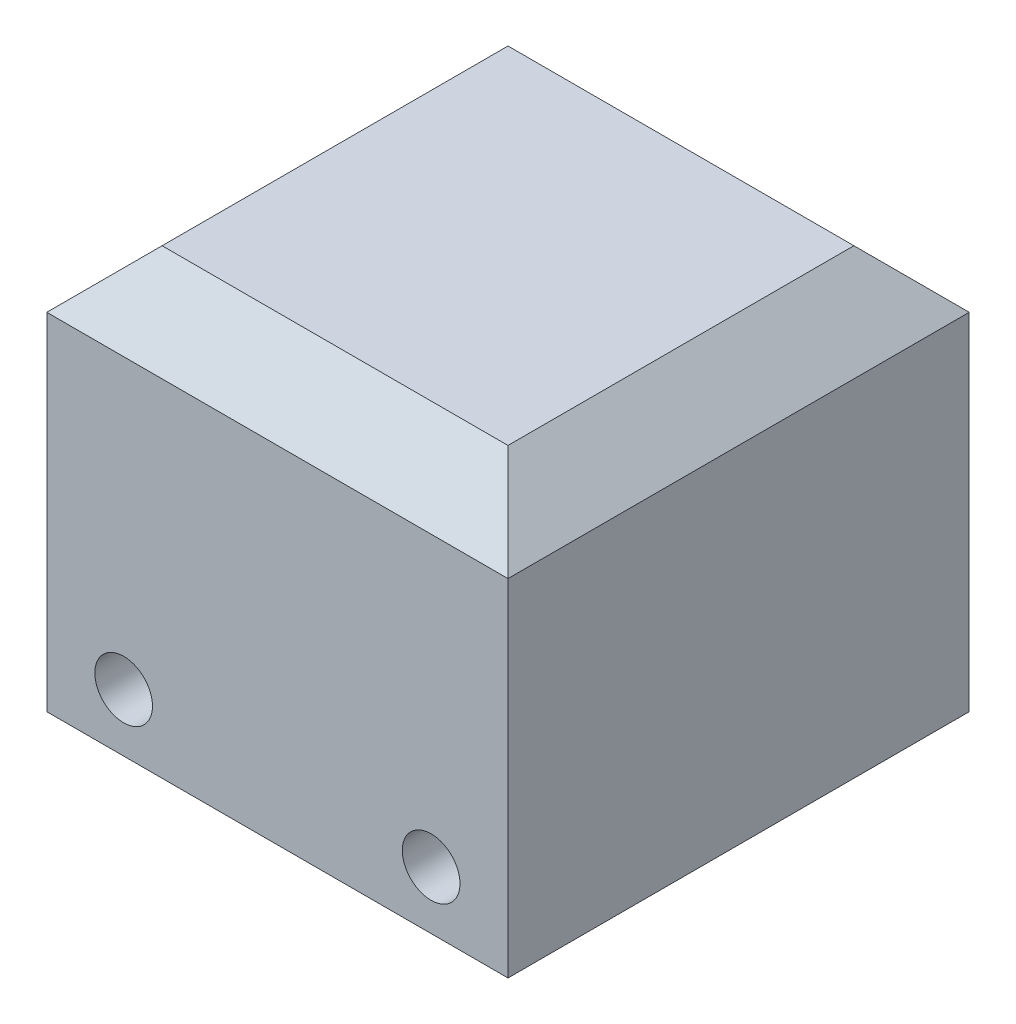
ISO-10303-21;
HEADER;
FILE_DESCRIPTION(('STEP AP214'),'2;1');
FILE_NAME('part.step','',(''),(''),'','','');
FILE_SCHEMA(('AUTOMOTIVE_DESIGN { 1 0 10303 214 1 1 1 1 }'));
ENDSEC;
DATA;
#1=APPLICATION_CONTEXT('core data for automotive mechanical design processes');
#2=APPLICATION_PROTOCOL_DEFINITION('international standard','automotive_design',2000,#1);
#3=PRODUCT_CONTEXT('',#1,'mechanical');
#4=PRODUCT('Part','Part','',(#3));
#5=PRODUCT_RELATED_PRODUCT_CATEGORY('part','',(#4));
#6=PRODUCT_DEFINITION_FORMATION('','',#4);
#7=PRODUCT_DEFINITION_CONTEXT('part definition',#1,'design');
#8=PRODUCT_DEFINITION('design','',#6,#7);
#9=PRODUCT_DEFINITION_SHAPE('','',#8);
#10=(LENGTH_UNIT() NAMED_UNIT(*) SI_UNIT(.MILLI.,.METRE.));
#11=(NAMED_UNIT(*) PLANE_ANGLE_UNIT() SI_UNIT($,.RADIAN.));
#12=(NAMED_UNIT(*) SI_UNIT($,.STERADIAN.) SOLID_ANGLE_UNIT());
#13=UNCERTAINTY_MEASURE_WITH_UNIT(LENGTH_MEASURE(1.E-05),#10,'distance_accuracy_value','');
#14=(GEOMETRIC_REPRESENTATION_CONTEXT(3) GLOBAL_UNCERTAINTY_ASSIGNED_CONTEXT((#13)) GLOBAL_UNIT_ASSIGNED_CONTEXT((#10,
#11,#12)) REPRESENTATION_CONTEXT('',''));
#15=CARTESIAN_POINT('',(0.,0.,0.));
#16=DIRECTION('',(0.,0.,1.));
#17=DIRECTION('',(1.,0.,0.));
#18=AXIS2_PLACEMENT_3D('',#15,#16,#17);
#19=CARTESIAN_POINT('',(31.75,21.7518028846154,-38.1));
#20=DIRECTION('',(1.,0.,0.));
#21=DIRECTION('',(0.,1.,0.));
#22=AXIS2_PLACEMENT_3D('',#19,#20,#21);
#23=PLANE('',#22);
#24=DIRECTION('',(0.,1.,0.));
#25=VECTOR('',#24,1.);
#26=CARTESIAN_POINT('',(31.75,21.7518028846154,38.1));
#27=LINE('',#26,#25);
#28=CARTESIAN_POINT('',(31.75,-44.9231971153845,38.1));
#29=VERTEX_POINT('',#28);
#30=CARTESIAN_POINT('',(31.75,12.2268028846153,38.1));
#31=VERTEX_POINT('',#30);
#32=EDGE_CURVE('E210',#29,#31,#27,.T.);
#33=ORIENTED_EDGE('',*,*,#32,.F.);
#34=DIRECTION('',(0.,0.,-1.));
#35=VECTOR('',#34,1.);
#36=CARTESIAN_POINT('',(31.75,-44.9231971153846,-38.1));
#37=LINE('',#36,#35);
#38=CARTESIAN_POINT('',(31.75,-44.9231971153845,-38.1));
#39=VERTEX_POINT('',#38);
#40=EDGE_CURVE('E163',#29,#39,#37,.T.);
#41=ORIENTED_EDGE('',*,*,#40,.T.);
#42=DIRECTION('',(0.,1.,0.));
#43=VECTOR('',#42,1.);
#44=CARTESIAN_POINT('',(31.75,21.7518028846154,-38.1));
#45=LINE('',#44,#43);
#46=CARTESIAN_POINT('',(31.75,12.2268028846153,-38.1));
#47=VERTEX_POINT('',#46);
#48=EDGE_CURVE('E231',#39,#47,#45,.T.);
#49=ORIENTED_EDGE('',*,*,#48,.T.);
#50=DIRECTION('',(0.,0.,1.));
#51=VECTOR('',#50,1.);
#52=CARTESIAN_POINT('',(31.75,12.2268028846153,-38.1));
#53=LINE('',#52,#51);
#54=EDGE_CURVE('E160',#47,#31,#53,.T.);
#55=ORIENTED_EDGE('',*,*,#54,.T.);
#56=EDGE_LOOP('',(#33,#41,#49,#55));
#57=FACE_BOUND('',#56,.T.);
#58=ADVANCED_FACE('F41',(#57),#23,.T.);
#59=CARTESIAN_POINT('',(-44.45,-54.4481971153846,-38.1));
#60=DIRECTION('',(0.,-1.,0.));
#61=DIRECTION('',(0.,0.,-1.));
#62=AXIS2_PLACEMENT_3D('',#59,#60,#61);
#63=PLANE('',#62);
#64=DIRECTION('',(0.,0.,-1.));
#65=VECTOR('',#64,1.);
#66=CARTESIAN_POINT('',(-34.925,-54.4481971153846,-38.1));
#67=LINE('',#66,#65);
#68=CARTESIAN_POINT('',(-34.925,-54.4481971153846,28.575));
#69=VERTEX_POINT('',#68);
#70=CARTESIAN_POINT('',(-34.925,-54.4481971153846,-28.575));
#71=VERTEX_POINT('',#70);
#72=EDGE_CURVE('E134',#69,#71,#67,.T.);
#73=ORIENTED_EDGE('',*,*,#72,.T.);
#74=DIRECTION('',(1.,0.,0.));
#75=VECTOR('',#74,1.);
#76=CARTESIAN_POINT('',(31.75,-54.4481971153846,-28.575));
#77=LINE('',#76,#75);
#78=CARTESIAN_POINT('',(22.225,-54.4481971153846,-28.575));
#79=VERTEX_POINT('',#78);
#80=EDGE_CURVE('E113',#71,#79,#77,.T.);
#81=ORIENTED_EDGE('',*,*,#80,.T.);
#82=DIRECTION('',(0.,0.,1.));
#83=VECTOR('',#82,1.);
#84=CARTESIAN_POINT('',(22.225,-54.4481971153846,-38.1));
#85=LINE('',#84,#83);
#86=CARTESIAN_POINT('',(22.225,-54.4481971153846,28.575));
#87=VERTEX_POINT('',#86);
#88=EDGE_CURVE('E122',#79,#87,#85,.T.);
#89=ORIENTED_EDGE('',*,*,#88,.T.);
#90=DIRECTION('',(-1.,0.,0.));
#91=VECTOR('',#90,1.);
#92=CARTESIAN_POINT('',(-44.45,-54.4481971153846,28.575));
#93=LINE('',#92,#91);
#94=EDGE_CURVE('E129',#87,#69,#93,.T.);
#95=ORIENTED_EDGE('',*,*,#94,.T.);
#96=EDGE_LOOP('',(#73,#81,#89,#95));
#97=FACE_BOUND('',#96,.T.);
#98=ADVANCED_FACE('F132',(#97),#63,.T.);
#99=CARTESIAN_POINT('',(-44.45,21.7518028846154,-38.1));
#100=DIRECTION('',(-1.,0.,0.));
#101=DIRECTION('',(0.,-1.,0.));
#102=AXIS2_PLACEMENT_3D('',#99,#100,#101);
#103=PLANE('',#102);
#104=DIRECTION('',(0.,-1.,0.));
#105=VECTOR('',#104,1.);
#106=CARTESIAN_POINT('',(-44.45,21.7518028846154,-38.1));
#107=LINE('',#106,#105);
#108=CARTESIAN_POINT('',(-44.45,12.2268028846153,-38.1));
#109=VERTEX_POINT('',#108);
#110=CARTESIAN_POINT('',(-44.45,-44.9231971153845,-38.1));
#111=VERTEX_POINT('',#110);
#112=EDGE_CURVE('E130',#109,#111,#107,.T.);
#113=ORIENTED_EDGE('',*,*,#112,.T.);
#114=DIRECTION('',(0.,0.,1.));
#115=VECTOR('',#114,1.);
#116=CARTESIAN_POINT('',(-44.45,-44.9231971153846,-38.1));
#117=LINE('',#116,#115);
#118=CARTESIAN_POINT('',(-44.45,-44.9231971153845,38.1));
#119=VERTEX_POINT('',#118);
#120=EDGE_CURVE('E151',#111,#119,#117,.T.);
#121=ORIENTED_EDGE('',*,*,#120,.T.);
#122=DIRECTION('',(0.,-1.,0.));
#123=VECTOR('',#122,1.);
#124=CARTESIAN_POINT('',(-44.45,21.7518028846154,38.1));
#125=LINE('',#124,#123);
#126=CARTESIAN_POINT('',(-44.45,12.2268028846153,38.1));
#127=VERTEX_POINT('',#126);
#128=EDGE_CURVE('E207',#127,#119,#125,.T.);
#129=ORIENTED_EDGE('',*,*,#128,.F.);
#130=DIRECTION('',(0.,0.,-1.));
#131=VECTOR('',#130,1.);
#132=CARTESIAN_POINT('',(-44.45,12.2268028846153,-38.1));
#133=LINE('',#132,#131);
#134=EDGE_CURVE('E148',#127,#109,#133,.T.);
#135=ORIENTED_EDGE('',*,*,#134,.T.);
#136=EDGE_LOOP('',(#113,#121,#129,#135));
#137=FACE_BOUND('',#136,.T.);
#138=ADVANCED_FACE('F213',(#137),#103,.T.);
#139=CARTESIAN_POINT('',(-44.45,21.7518028846154,-38.1));
#140=DIRECTION('',(0.,1.,0.));
#141=DIRECTION('',(0.,0.,1.));
#142=AXIS2_PLACEMENT_3D('',#139,#140,#141);
#143=PLANE('',#142);
#144=DIRECTION('',(0.,0.,-1.));
#145=VECTOR('',#144,1.);
#146=CARTESIAN_POINT('',(22.225,21.7518028846154,-38.1));
#147=LINE('',#146,#145);
#148=CARTESIAN_POINT('',(22.225,21.7518028846154,28.575));
#149=VERTEX_POINT('',#148);
#150=CARTESIAN_POINT('',(22.225,21.7518028846154,-28.575));
#151=VERTEX_POINT('',#150);
#152=EDGE_CURVE('E52',#149,#151,#147,.T.);
#153=ORIENTED_EDGE('',*,*,#152,.T.);
#154=DIRECTION('',(-1.,0.,0.));
#155=VECTOR('',#154,1.);
#156=CARTESIAN_POINT('',(-44.45,21.7518028846154,-28.575));
#157=LINE('',#156,#155);
#158=CARTESIAN_POINT('',(-34.925,21.7518028846154,-28.575));
#159=VERTEX_POINT('',#158);
#160=EDGE_CURVE('E11',#151,#159,#157,.T.);
#161=ORIENTED_EDGE('',*,*,#160,.T.);
#162=DIRECTION('',(0.,0.,1.));
#163=VECTOR('',#162,1.);
#164=CARTESIAN_POINT('',(-34.925,21.7518028846154,-38.1));
#165=LINE('',#164,#163);
#166=CARTESIAN_POINT('',(-34.925,21.7518028846154,28.575));
#167=VERTEX_POINT('',#166);
#168=EDGE_CURVE('E166',#159,#167,#165,.T.);
#169=ORIENTED_EDGE('',*,*,#168,.T.);
#170=DIRECTION('',(1.,0.,0.));
#171=VECTOR('',#170,1.);
#172=CARTESIAN_POINT('',(-44.45,21.7518028846154,28.575));
#173=LINE('',#172,#171);
#174=EDGE_CURVE('E63',#167,#149,#173,.T.);
#175=ORIENTED_EDGE('',*,*,#174,.T.);
#176=EDGE_LOOP('',(#153,#161,#169,#175));
#177=FACE_BOUND('',#176,.T.);
#178=ADVANCED_FACE('F255',(#177),#143,.T.);
#179=CARTESIAN_POINT('',(0.,0.,-38.1));
#180=DIRECTION('',(0.,0.,1.));
#181=DIRECTION('',(1.,0.,0.));
#182=AXIS2_PLACEMENT_3D('',#179,#180,#181);
#183=PLANE('',#182);
#184=CARTESIAN_POINT('',(19.05,-35.3981971153846,-38.1));
#185=DIRECTION('',(0.,0.,1.));
#186=DIRECTION('',(-1.,0.,0.));
#187=AXIS2_PLACEMENT_3D('',#184,#185,#186);
#188=CIRCLE('',#187,4.7625);
#189=CARTESIAN_POINT('',(23.8125,-35.3981971153846,-38.1));
#190=VERTEX_POINT('',#189);
#191=EDGE_CURVE('E217',#190,#190,#188,.T.);
#192=ORIENTED_EDGE('',*,*,#191,.T.);
#193=EDGE_LOOP('',(#192));
#194=FACE_BOUND('',#193,.T.);
#195=CARTESIAN_POINT('',(-31.75,-35.3981971153846,-38.1));
#196=DIRECTION('',(0.,0.,1.));
#197=DIRECTION('',(1.,0.,0.));
#198=AXIS2_PLACEMENT_3D('',#195,#196,#197);
#199=CIRCLE('',#198,4.7625);
#200=CARTESIAN_POINT('',(-26.9875,-35.3981971153846,-38.1));
#201=VERTEX_POINT('',#200);
#202=EDGE_CURVE('E222',#201,#201,#199,.T.);
#203=ORIENTED_EDGE('',*,*,#202,.T.);
#204=EDGE_LOOP('',(#203));
#205=FACE_BOUND('',#204,.T.);
#206=ORIENTED_EDGE('',*,*,#48,.F.);
#207=DIRECTION('',(-1.,0.,0.));
#208=VECTOR('',#207,1.);
#209=CARTESIAN_POINT('',(-44.45,-44.9231971153846,-38.1));
#210=LINE('',#209,#208);
#211=EDGE_CURVE('E115',#39,#111,#210,.T.);
#212=ORIENTED_EDGE('',*,*,#211,.T.);
#213=ORIENTED_EDGE('',*,*,#112,.F.);
#214=DIRECTION('',(1.,0.,0.));
#215=VECTOR('',#214,1.);
#216=CARTESIAN_POINT('',(31.75,12.2268028846153,-38.1));
#217=LINE('',#216,#215);
#218=EDGE_CURVE('E137',#109,#47,#217,.T.);
#219=ORIENTED_EDGE('',*,*,#218,.T.);
#220=EDGE_LOOP('',(#206,#212,#213,#219));
#221=FACE_BOUND('',#220,.T.);
#222=ADVANCED_FACE('F244',(#194,#205,#221),#183,.F.);
#223=CARTESIAN_POINT('',(-31.75,-35.3981971153846,-38.1));
#224=DIRECTION('',(0.,0.,1.));
#225=DIRECTION('',(1.,0.,0.));
#226=AXIS2_PLACEMENT_3D('',#223,#224,#225);
#227=CYLINDRICAL_SURFACE('',#226,4.7625);
#228=CARTESIAN_POINT('',(-31.75,-35.3981971153846,38.1));
#229=DIRECTION('',(0.,0.,1.));
#230=DIRECTION('',(1.,0.,0.));
#231=AXIS2_PLACEMENT_3D('',#228,#229,#230);
#232=CIRCLE('',#231,4.7625);
#233=CARTESIAN_POINT('',(-26.9875,-35.3981971153846,38.1));
#234=VERTEX_POINT('',#233);
#235=EDGE_CURVE('E224',#234,#234,#232,.T.);
#236=CARTESIAN_POINT('',(-26.9875,-35.3981971153846,-38.1));
#237=CARTESIAN_POINT('',(-26.9875,-35.3981971153846,-37.30625));
#238=CARTESIAN_POINT('',(-26.9875,-35.3981971153846,-36.5125));
#239=CARTESIAN_POINT('',(-26.9875,-35.3981971153846,-34.925));
#240=CARTESIAN_POINT('',(-26.9875,-35.3981971153846,-34.13125));
#241=CARTESIAN_POINT('',(-26.9875,-35.3981971153846,-32.54375));
#242=CARTESIAN_POINT('',(-26.9875,-35.3981971153846,-31.75));
#243=CARTESIAN_POINT('',(-26.9875,-35.3981971153846,-30.1625));
#244=CARTESIAN_POINT('',(-26.9875,-35.3981971153846,-29.36875));
#245=CARTESIAN_POINT('',(-26.9875,-35.3981971153846,-27.78125));
#246=CARTESIAN_POINT('',(-26.9875,-35.3981971153846,-26.9875));
#247=CARTESIAN_POINT('',(-26.9875,-35.3981971153846,-25.4));
#248=CARTESIAN_POINT('',(-26.9875,-35.3981971153846,-24.60625));
#249=CARTESIAN_POINT('',(-26.9875,-35.3981971153846,-23.01875));
#250=CARTESIAN_POINT('',(-26.9875,-35.3981971153846,-22.225));
#251=CARTESIAN_POINT('',(-26.9875,-35.3981971153846,-20.6375));
#252=CARTESIAN_POINT('',(-26.9875,-35.3981971153846,-19.84375));
#253=CARTESIAN_POINT('',(-26.9875,-35.3981971153846,-18.25625));
#254=CARTESIAN_POINT('',(-26.9875,-35.3981971153846,-17.4625));
#255=CARTESIAN_POINT('',(-26.9875,-35.3981971153846,-15.875));
#256=CARTESIAN_POINT('',(-26.9875,-35.3981971153846,-15.08125));
#257=CARTESIAN_POINT('',(-26.9875,-35.3981971153846,-13.49375));
#258=CARTESIAN_POINT('',(-26.9875,-35.3981971153846,-12.7));
#259=CARTESIAN_POINT('',(-26.9875,-35.3981971153846,-11.1125));
#260=CARTESIAN_POINT('',(-26.9875,-35.3981971153846,-10.31875));
#261=CARTESIAN_POINT('',(-26.9875,-35.3981971153846,-8.73125));
#262=CARTESIAN_POINT('',(-26.9875,-35.3981971153846,-7.9375));
#263=CARTESIAN_POINT('',(-26.9875,-35.3981971153846,-6.35));
#264=CARTESIAN_POINT('',(-26.9875,-35.3981971153846,-5.55625));
#265=CARTESIAN_POINT('',(-26.9875,-35.3981971153846,-3.96875));
#266=CARTESIAN_POINT('',(-26.9875,-35.3981971153846,-3.175));
#267=CARTESIAN_POINT('',(-26.9875,-35.3981971153846,-1.5875));
#268=CARTESIAN_POINT('',(-26.9875,-35.3981971153846,-0.793750000000001));
#269=CARTESIAN_POINT('',(-26.9875,-35.3981971153846,0.793750000000001));
#270=CARTESIAN_POINT('',(-26.9875,-35.3981971153846,1.5875));
#271=CARTESIAN_POINT('',(-26.9875,-35.3981971153846,3.175));
#272=CARTESIAN_POINT('',(-26.9875,-35.3981971153846,3.96875));
#273=CARTESIAN_POINT('',(-26.9875,-35.3981971153846,5.55625));
#274=CARTESIAN_POINT('',(-26.9875,-35.3981971153846,6.35));
#275=CARTESIAN_POINT('',(-26.9875,-35.3981971153846,7.93750000000001));
#276=CARTESIAN_POINT('',(-26.9875,-35.3981971153846,8.73125));
#277=CARTESIAN_POINT('',(-26.9875,-35.3981971153846,10.31875));
#278=CARTESIAN_POINT('',(-26.9875,-35.3981971153846,11.1125));
#279=CARTESIAN_POINT('',(-26.9875,-35.3981971153846,12.7));
#280=CARTESIAN_POINT('',(-26.9875,-35.3981971153846,13.49375));
#281=CARTESIAN_POINT('',(-26.9875,-35.3981971153846,15.08125));
#282=CARTESIAN_POINT('',(-26.9875,-35.3981971153846,15.875));
#283=CARTESIAN_POINT('',(-26.9875,-35.3981971153846,17.4625));
#284=CARTESIAN_POINT('',(-26.9875,-35.3981971153846,18.25625));
#285=CARTESIAN_POINT('',(-26.9875,-35.3981971153846,19.84375));
#286=CARTESIAN_POINT('',(-26.9875,-35.3981971153846,20.6375));
#287=CARTESIAN_POINT('',(-26.9875,-35.3981971153846,22.225));
#288=CARTESIAN_POINT('',(-26.9875,-35.3981971153846,23.01875));
#289=CARTESIAN_POINT('',(-26.9875,-35.3981971153846,24.60625));
#290=CARTESIAN_POINT('',(-26.9875,-35.3981971153846,25.4));
#291=CARTESIAN_POINT('',(-26.9875,-35.3981971153846,26.9875));
#292=CARTESIAN_POINT('',(-26.9875,-35.3981971153846,27.78125));
#293=CARTESIAN_POINT('',(-26.9875,-35.3981971153846,29.36875));
#294=CARTESIAN_POINT('',(-26.9875,-35.3981971153846,30.1625));
#295=CARTESIAN_POINT('',(-26.9875,-35.3981971153846,31.75));
#296=CARTESIAN_POINT('',(-26.9875,-35.3981971153846,32.54375));
#297=CARTESIAN_POINT('',(-26.9875,-35.3981971153846,34.13125));
#298=CARTESIAN_POINT('',(-26.9875,-35.3981971153846,34.925));
#299=CARTESIAN_POINT('',(-26.9875,-35.3981971153846,36.5125));
#300=CARTESIAN_POINT('',(-26.9875,-35.3981971153846,37.30625));
#301=CARTESIAN_POINT('',(-26.9875,-35.3981971153846,38.1));
#302=B_SPLINE_CURVE_WITH_KNOTS('',3,(#236,#237,#238,#239,#240,#241,#242,#243,#244,#245,#246,
#247,#248,#249,#250,#251,#252,#253,#254,#255,#256,#257,#258,#259,#260,#261,#262,#263,#264,#265,
#266,#267,#268,#269,#270,#271,#272,#273,#274,#275,#276,#277,#278,#279,#280,#281,#282,#283,#284,
#285,#286,#287,#288,#289,#290,#291,#292,#293,#294,#295,#296,#297,#298,#299,#300,#301),
.UNSPECIFIED.,.F.,.F.,(4,2,2,2,2,2,2,2,2,2,2,2,2,2,2,2,2,2,2,2,2,2,2,2,2,2,2,2,2,2,2,2,4),(0.,
2.38124999999999,4.7625,7.14375,9.525,11.90625,14.2875,16.66875,19.05,21.43125,23.8125,26.19375,
28.575,30.95625,33.3375,35.71875,38.1,40.48125,42.8625,45.24375,47.625,50.00625,52.3875,
54.76875,57.15,59.53125,61.9125,64.29375,66.675,69.05625,71.4375,73.81875,76.2),.UNSPECIFIED.);
#303=EDGE_CURVE('BSEAM329',#201,#234,#302,.T.);
#304=ORIENTED_EDGE('',*,*,#202,.F.);
#305=ORIENTED_EDGE('',*,*,#235,.T.);
#306=ORIENTED_EDGE('',*,*,#303,.T.);
#307=ORIENTED_EDGE('',*,*,#303,.F.);
#308=EDGE_LOOP('',(#304,#306,#305,#307));
#309=FACE_BOUND('',#308,.T.);
#310=ADVANCED_FACE('F329',(#309),#227,.F.);
#311=CARTESIAN_POINT('',(19.05,-35.3981971153846,-38.1));
#312=DIRECTION('',(0.,0.,1.));
#313=DIRECTION('',(1.,0.,0.));
#314=AXIS2_PLACEMENT_3D('',#311,#312,#313);
#315=CYLINDRICAL_SURFACE('',#314,4.7625);
#316=CARTESIAN_POINT('',(19.05,-35.3981971153846,38.1));
#317=DIRECTION('',(0.,0.,1.));
#318=DIRECTION('',(-1.,0.,0.));
#319=AXIS2_PLACEMENT_3D('',#316,#317,#318);
#320=CIRCLE('',#319,4.7625);
#321=CARTESIAN_POINT('',(23.8125,-35.3981971153846,38.1));
#322=VERTEX_POINT('',#321);
#323=EDGE_CURVE('E181',#322,#322,#320,.T.);
#324=CARTESIAN_POINT('',(23.8125,-35.3981971153846,-38.1));
#325=CARTESIAN_POINT('',(23.8125,-35.3981971153846,-37.30625));
#326=CARTESIAN_POINT('',(23.8125,-35.3981971153846,-36.5125));
#327=CARTESIAN_POINT('',(23.8125,-35.3981971153846,-34.925));
#328=CARTESIAN_POINT('',(23.8125,-35.3981971153846,-34.13125));
#329=CARTESIAN_POINT('',(23.8125,-35.3981971153846,-32.54375));
#330=CARTESIAN_POINT('',(23.8125,-35.3981971153846,-31.75));
#331=CARTESIAN_POINT('',(23.8125,-35.3981971153846,-30.1625));
#332=CARTESIAN_POINT('',(23.8125,-35.3981971153846,-29.36875));
#333=CARTESIAN_POINT('',(23.8125,-35.3981971153846,-27.78125));
#334=CARTESIAN_POINT('',(23.8125,-35.3981971153846,-26.9875));
#335=CARTESIAN_POINT('',(23.8125,-35.3981971153846,-25.4));
#336=CARTESIAN_POINT('',(23.8125,-35.3981971153846,-24.60625));
#337=CARTESIAN_POINT('',(23.8125,-35.3981971153846,-23.01875));
#338=CARTESIAN_POINT('',(23.8125,-35.3981971153846,-22.225));
#339=CARTESIAN_POINT('',(23.8125,-35.3981971153846,-20.6375));
#340=CARTESIAN_POINT('',(23.8125,-35.3981971153846,-19.84375));
#341=CARTESIAN_POINT('',(23.8125,-35.3981971153846,-18.25625));
#342=CARTESIAN_POINT('',(23.8125,-35.3981971153846,-17.4625));
#343=CARTESIAN_POINT('',(23.8125,-35.3981971153846,-15.875));
#344=CARTESIAN_POINT('',(23.8125,-35.3981971153846,-15.08125));
#345=CARTESIAN_POINT('',(23.8125,-35.3981971153846,-13.49375));
#346=CARTESIAN_POINT('',(23.8125,-35.3981971153846,-12.7));
#347=CARTESIAN_POINT('',(23.8125,-35.3981971153846,-11.1125));
#348=CARTESIAN_POINT('',(23.8125,-35.3981971153846,-10.31875));
#349=CARTESIAN_POINT('',(23.8125,-35.3981971153846,-8.73125));
#350=CARTESIAN_POINT('',(23.8125,-35.3981971153846,-7.9375));
#351=CARTESIAN_POINT('',(23.8125,-35.3981971153846,-6.35));
#352=CARTESIAN_POINT('',(23.8125,-35.3981971153846,-5.55625));
#353=CARTESIAN_POINT('',(23.8125,-35.3981971153846,-3.96875));
#354=CARTESIAN_POINT('',(23.8125,-35.3981971153846,-3.175));
#355=CARTESIAN_POINT('',(23.8125,-35.3981971153846,-1.5875));
#356=CARTESIAN_POINT('',(23.8125,-35.3981971153846,-0.793750000000001));
#357=CARTESIAN_POINT('',(23.8125,-35.3981971153846,0.793750000000001));
#358=CARTESIAN_POINT('',(23.8125,-35.3981971153846,1.5875));
#359=CARTESIAN_POINT('',(23.8125,-35.3981971153846,3.175));
#360=CARTESIAN_POINT('',(23.8125,-35.3981971153846,3.96875));
#361=CARTESIAN_POINT('',(23.8125,-35.3981971153846,5.55625));
#362=CARTESIAN_POINT('',(23.8125,-35.3981971153846,6.35));
#363=CARTESIAN_POINT('',(23.8125,-35.3981971153846,7.93750000000001));
#364=CARTESIAN_POINT('',(23.8125,-35.3981971153846,8.73125));
#365=CARTESIAN_POINT('',(23.8125,-35.3981971153846,10.31875));
#366=CARTESIAN_POINT('',(23.8125,-35.3981971153846,11.1125));
#367=CARTESIAN_POINT('',(23.8125,-35.3981971153846,12.7));
#368=CARTESIAN_POINT('',(23.8125,-35.3981971153846,13.49375));
#369=CARTESIAN_POINT('',(23.8125,-35.3981971153846,15.08125));
#370=CARTESIAN_POINT('',(23.8125,-35.3981971153846,15.875));
#371=CARTESIAN_POINT('',(23.8125,-35.3981971153846,17.4625));
#372=CARTESIAN_POINT('',(23.8125,-35.3981971153846,18.25625));
#373=CARTESIAN_POINT('',(23.8125,-35.3981971153846,19.84375));
#374=CARTESIAN_POINT('',(23.8125,-35.3981971153846,20.6375));
#375=CARTESIAN_POINT('',(23.8125,-35.3981971153846,22.225));
#376=CARTESIAN_POINT('',(23.8125,-35.3981971153846,23.01875));
#377=CARTESIAN_POINT('',(23.8125,-35.3981971153846,24.60625));
#378=CARTESIAN_POINT('',(23.8125,-35.3981971153846,25.4));
#379=CARTESIAN_POINT('',(23.8125,-35.3981971153846,26.9875));
#380=CARTESIAN_POINT('',(23.8125,-35.3981971153846,27.78125));
#381=CARTESIAN_POINT('',(23.8125,-35.3981971153846,29.36875));
#382=CARTESIAN_POINT('',(23.8125,-35.3981971153846,30.1625));
#383=CARTESIAN_POINT('',(23.8125,-35.3981971153846,31.75));
#384=CARTESIAN_POINT('',(23.8125,-35.3981971153846,32.54375));
#385=CARTESIAN_POINT('',(23.8125,-35.3981971153846,34.13125));
#386=CARTESIAN_POINT('',(23.8125,-35.3981971153846,34.925));
#387=CARTESIAN_POINT('',(23.8125,-35.3981971153846,36.5125));
#388=CARTESIAN_POINT('',(23.8125,-35.3981971153846,37.30625));
#389=CARTESIAN_POINT('',(23.8125,-35.3981971153846,38.1));
#390=B_SPLINE_CURVE_WITH_KNOTS('',3,(#324,#325,#326,#327,#328,#329,#330,#331,#332,#333,#334,
#335,#336,#337,#338,#339,#340,#341,#342,#343,#344,#345,#346,#347,#348,#349,#350,#351,#352,#353,
#354,#355,#356,#357,#358,#359,#360,#361,#362,#363,#364,#365,#366,#367,#368,#369,#370,#371,#372,
#373,#374,#375,#376,#377,#378,#379,#380,#381,#382,#383,#384,#385,#386,#387,#388,#389),
.UNSPECIFIED.,.F.,.F.,(4,2,2,2,2,2,2,2,2,2,2,2,2,2,2,2,2,2,2,2,2,2,2,2,2,2,2,2,2,2,2,2,4),(0.,
2.38124999999999,4.7625,7.14375,9.525,11.90625,14.2875,16.66875,19.05,21.43125,23.8125,26.19375,
28.575,30.95625,33.3375,35.71875,38.1,40.48125,42.8625,45.24375,47.625,50.00625,52.3875,
54.76875,57.15,59.53125,61.9125,64.29375,66.675,69.05625,71.4375,73.81875,76.2),.UNSPECIFIED.);
#391=EDGE_CURVE('BSEAM320',#190,#322,#390,.T.);
#392=ORIENTED_EDGE('',*,*,#191,.F.);
#393=ORIENTED_EDGE('',*,*,#323,.T.);
#394=ORIENTED_EDGE('',*,*,#391,.T.);
#395=ORIENTED_EDGE('',*,*,#391,.F.);
#396=EDGE_LOOP('',(#392,#394,#393,#395));
#397=FACE_BOUND('',#396,.T.);
#398=ADVANCED_FACE('F320',(#397),#315,.F.);
#399=CARTESIAN_POINT('',(0.,0.,38.1));
#400=DIRECTION('',(0.,0.,1.));
#401=DIRECTION('',(1.,0.,0.));
#402=AXIS2_PLACEMENT_3D('',#399,#400,#401);
#403=PLANE('',#402);
#404=ORIENTED_EDGE('',*,*,#235,.F.);
#405=EDGE_LOOP('',(#404));
#406=FACE_BOUND('',#405,.T.);
#407=ORIENTED_EDGE('',*,*,#128,.T.);
#408=DIRECTION('',(1.,0.,0.));
#409=VECTOR('',#408,1.);
#410=CARTESIAN_POINT('',(0.,-44.9231971153846,38.1));
#411=LINE('',#410,#409);
#412=EDGE_CURVE('E157',#119,#29,#411,.T.);
#413=ORIENTED_EDGE('',*,*,#412,.T.);
#414=ORIENTED_EDGE('',*,*,#32,.T.);
#415=DIRECTION('',(-1.,0.,0.));
#416=VECTOR('',#415,1.);
#417=CARTESIAN_POINT('',(0.,12.2268028846153,38.1));
#418=LINE('',#417,#416);
#419=EDGE_CURVE('E154',#31,#127,#418,.T.);
#420=ORIENTED_EDGE('',*,*,#419,.T.);
#421=EDGE_LOOP('',(#407,#413,#414,#420));
#422=FACE_BOUND('',#421,.T.);
#423=ORIENTED_EDGE('',*,*,#323,.F.);
#424=EDGE_LOOP('',(#423));
#425=FACE_BOUND('',#424,.T.);
#426=ADVANCED_FACE('F205',(#406,#422,#425),#403,.T.);
#427=CARTESIAN_POINT('',(0.,-44.9231971153846,38.1));
#428=DIRECTION('',(0.,0.707106781186546,-0.707106781186549));
#429=DIRECTION('',(1.,0.,0.));
#430=AXIS2_PLACEMENT_3D('',#427,#428,#429);
#431=PLANE('',#430);
#432=DIRECTION('',(-0.577350269189625,-0.577350269189627,-0.577350269189625));
#433=VECTOR('',#432,1.);
#434=CARTESIAN_POINT('',(0.,-76.6731971153846,6.35000000000007));
#435=LINE('',#434,#433);
#436=EDGE_CURVE('E125',#29,#87,#435,.T.);
#437=ORIENTED_EDGE('',*,*,#436,.F.);
#438=ORIENTED_EDGE('',*,*,#412,.F.);
#439=DIRECTION('',(0.577350269189625,-0.577350269189628,-0.577350269189625));
#440=VECTOR('',#439,1.);
#441=CARTESIAN_POINT('',(-29.6333333333334,-59.7398637820513,23.2833333333334));
#442=LINE('',#441,#440);
#443=EDGE_CURVE('E177',#69,#119,#442,.F.);
#444=ORIENTED_EDGE('',*,*,#443,.F.);
#445=ORIENTED_EDGE('',*,*,#94,.F.);
#446=EDGE_LOOP('',(#437,#438,#444,#445));
#447=FACE_BOUND('',#446,.T.);
#448=ADVANCED_FACE('F239',(#447),#431,.F.);
#449=CARTESIAN_POINT('',(-44.45,-44.9231971153846,-38.1));
#450=DIRECTION('',(0.707106781186549,0.707106781186546,0.));
#451=DIRECTION('',(0.,0.,1.));
#452=AXIS2_PLACEMENT_3D('',#449,#450,#451);
#453=PLANE('',#452);
#454=ORIENTED_EDGE('',*,*,#443,.T.);
#455=ORIENTED_EDGE('',*,*,#120,.F.);
#456=DIRECTION('',(-0.577350269189625,0.577350269189628,-0.577350269189625));
#457=VECTOR('',#456,1.);
#458=CARTESIAN_POINT('',(-44.45,-44.9231971153846,-38.1));
#459=LINE('',#458,#457);
#460=EDGE_CURVE('E119',#71,#111,#459,.T.);
#461=ORIENTED_EDGE('',*,*,#460,.F.);
#462=ORIENTED_EDGE('',*,*,#72,.F.);
#463=EDGE_LOOP('',(#454,#455,#461,#462));
#464=FACE_BOUND('',#463,.T.);
#465=ADVANCED_FACE('F241',(#464),#453,.F.);
#466=CARTESIAN_POINT('',(22.225,-54.4481971153846,-38.1));
#467=DIRECTION('',(-0.707106781186549,0.707106781186546,0.));
#468=DIRECTION('',(0.,0.,1.));
#469=AXIS2_PLACEMENT_3D('',#466,#467,#468);
#470=PLANE('',#469);
#471=ORIENTED_EDGE('',*,*,#436,.T.);
#472=ORIENTED_EDGE('',*,*,#88,.F.);
#473=DIRECTION('',(-0.577350269189625,-0.577350269189627,0.577350269189625));
#474=VECTOR('',#473,1.);
#475=CARTESIAN_POINT('',(25.4,-51.2731971153846,-31.75));
#476=LINE('',#475,#474);
#477=EDGE_CURVE('E109',#39,#79,#476,.T.);
#478=ORIENTED_EDGE('',*,*,#477,.F.);
#479=ORIENTED_EDGE('',*,*,#40,.F.);
#480=EDGE_LOOP('',(#471,#472,#478,#479));
#481=FACE_BOUND('',#480,.T.);
#482=ADVANCED_FACE('F123',(#481),#470,.F.);
#483=CARTESIAN_POINT('',(-44.45,-54.4481971153846,-28.575));
#484=DIRECTION('',(0.,-0.707106781186546,-0.707106781186549));
#485=DIRECTION('',(-1.,0.,0.));
#486=AXIS2_PLACEMENT_3D('',#483,#484,#485);
#487=PLANE('',#486);
#488=ORIENTED_EDGE('',*,*,#460,.T.);
#489=ORIENTED_EDGE('',*,*,#211,.F.);
#490=ORIENTED_EDGE('',*,*,#477,.T.);
#491=ORIENTED_EDGE('',*,*,#80,.F.);
#492=EDGE_LOOP('',(#488,#489,#490,#491));
#493=FACE_BOUND('',#492,.T.);
#494=ADVANCED_FACE('F111',(#493),#487,.T.);
#495=CARTESIAN_POINT('',(0.,12.2268028846153,38.1));
#496=DIRECTION('',(0.,-0.707106781186546,-0.707106781186549));
#497=DIRECTION('',(-1.,0.,0.));
#498=AXIS2_PLACEMENT_3D('',#495,#496,#497);
#499=PLANE('',#498);
#500=DIRECTION('',(0.577350269189625,0.577350269189628,-0.577350269189625));
#501=VECTOR('',#500,1.);
#502=CARTESIAN_POINT('',(-12.7000000000001,43.9768028846154,6.35000000000006));
#503=LINE('',#502,#501);
#504=EDGE_CURVE('E187',#127,#167,#503,.T.);
#505=ORIENTED_EDGE('',*,*,#504,.F.);
#506=ORIENTED_EDGE('',*,*,#419,.F.);
#507=DIRECTION('',(-0.577350269189625,0.577350269189627,-0.577350269189625));
#508=VECTOR('',#507,1.);
#509=CARTESIAN_POINT('',(21.1666666666667,22.8101362179487,27.5166666666667));
#510=LINE('',#509,#508);
#511=EDGE_CURVE('E46',#149,#31,#510,.F.);
#512=ORIENTED_EDGE('',*,*,#511,.F.);
#513=ORIENTED_EDGE('',*,*,#174,.F.);
#514=EDGE_LOOP('',(#505,#506,#512,#513));
#515=FACE_BOUND('',#514,.T.);
#516=ADVANCED_FACE('F44',(#515),#499,.F.);
#517=CARTESIAN_POINT('',(31.75,12.2268028846153,-38.1));
#518=DIRECTION('',(-0.707106781186549,-0.707106781186546,0.));
#519=DIRECTION('',(0.,0.,1.));
#520=AXIS2_PLACEMENT_3D('',#517,#518,#519);
#521=PLANE('',#520);
#522=ORIENTED_EDGE('',*,*,#511,.T.);
#523=ORIENTED_EDGE('',*,*,#54,.F.);
#524=DIRECTION('',(0.577350269189625,-0.577350269189627,-0.577350269189625));
#525=VECTOR('',#524,1.);
#526=CARTESIAN_POINT('',(31.75,12.2268028846153,-38.1));
#527=LINE('',#526,#525);
#528=EDGE_CURVE('E185',#151,#47,#527,.T.);
#529=ORIENTED_EDGE('',*,*,#528,.F.);
#530=ORIENTED_EDGE('',*,*,#152,.F.);
#531=EDGE_LOOP('',(#522,#523,#529,#530));
#532=FACE_BOUND('',#531,.T.);
#533=ADVANCED_FACE('F198',(#532),#521,.F.);
#534=CARTESIAN_POINT('',(-34.925,21.7518028846154,-38.1));
#535=DIRECTION('',(0.707106781186549,-0.707106781186546,0.));
#536=DIRECTION('',(0.,0.,1.));
#537=AXIS2_PLACEMENT_3D('',#534,#535,#536);
#538=PLANE('',#537);
#539=ORIENTED_EDGE('',*,*,#504,.T.);
#540=ORIENTED_EDGE('',*,*,#168,.F.);
#541=DIRECTION('',(0.577350269189625,0.577350269189628,0.577350269189625));
#542=VECTOR('',#541,1.);
#543=CARTESIAN_POINT('',(-38.1,18.5768028846154,-31.75));
#544=LINE('',#543,#542);
#545=EDGE_CURVE('E182',#109,#159,#544,.T.);
#546=ORIENTED_EDGE('',*,*,#545,.F.);
#547=ORIENTED_EDGE('',*,*,#134,.F.);
#548=EDGE_LOOP('',(#539,#540,#546,#547));
#549=FACE_BOUND('',#548,.T.);
#550=ADVANCED_FACE('F284',(#549),#538,.F.);
#551=CARTESIAN_POINT('',(-44.45,21.7518028846154,-28.575));
#552=DIRECTION('',(0.,0.707106781186546,-0.707106781186549));
#553=DIRECTION('',(1.,0.,0.));
#554=AXIS2_PLACEMENT_3D('',#551,#552,#553);
#555=PLANE('',#554);
#556=ORIENTED_EDGE('',*,*,#528,.T.);
#557=ORIENTED_EDGE('',*,*,#218,.F.);
#558=ORIENTED_EDGE('',*,*,#545,.T.);
#559=ORIENTED_EDGE('',*,*,#160,.F.);
#560=EDGE_LOOP('',(#556,#557,#558,#559));
#561=FACE_BOUND('',#560,.T.);
#562=ADVANCED_FACE('F278',(#561),#555,.T.);
#563=CLOSED_SHELL('',(#58,#98,#138,#178,#222,#310,#398,#426,#448,#465,#482,#494,#516,#533,#550,#562));
#564=MANIFOLD_SOLID_BREP('B2',#563);
#565=ADVANCED_BREP_SHAPE_REPRESENTATION('',(#18,#564),#14);
#566=SHAPE_DEFINITION_REPRESENTATION(#9,#565);
ENDSEC;
END-ISO-10303-21;
